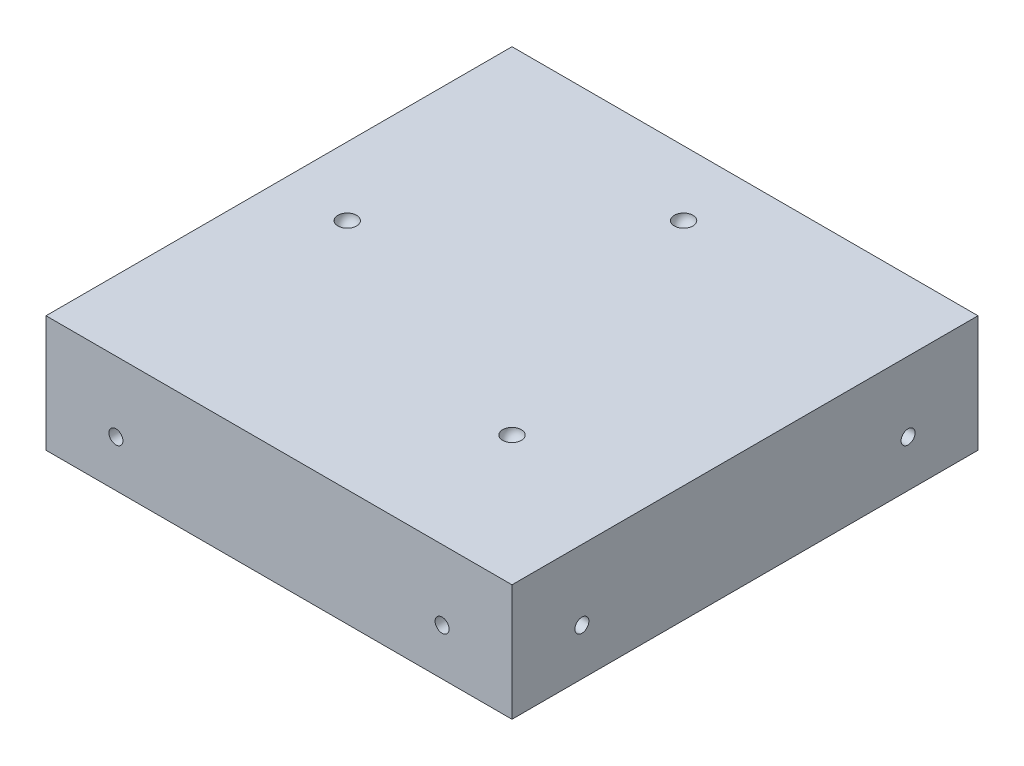
ISO-10303-21;
HEADER;
FILE_DESCRIPTION(('STEP AP214'),'2;1');
FILE_NAME('part.step','',(''),(''),'','','');
FILE_SCHEMA(('AUTOMOTIVE_DESIGN { 1 0 10303 214 1 1 1 1 }'));
ENDSEC;
DATA;
#1=APPLICATION_CONTEXT('core data for automotive mechanical design processes');
#2=APPLICATION_PROTOCOL_DEFINITION('international standard','automotive_design',2000,#1);
#3=PRODUCT_CONTEXT('',#1,'mechanical');
#4=PRODUCT('Part','Part','',(#3));
#5=PRODUCT_RELATED_PRODUCT_CATEGORY('part','',(#4));
#6=PRODUCT_DEFINITION_FORMATION('','',#4);
#7=PRODUCT_DEFINITION_CONTEXT('part definition',#1,'design');
#8=PRODUCT_DEFINITION('design','',#6,#7);
#9=PRODUCT_DEFINITION_SHAPE('','',#8);
#10=(LENGTH_UNIT() NAMED_UNIT(*) SI_UNIT(.MILLI.,.METRE.));
#11=(NAMED_UNIT(*) PLANE_ANGLE_UNIT() SI_UNIT($,.RADIAN.));
#12=(NAMED_UNIT(*) SI_UNIT($,.STERADIAN.) SOLID_ANGLE_UNIT());
#13=UNCERTAINTY_MEASURE_WITH_UNIT(LENGTH_MEASURE(1.E-05),#10,'distance_accuracy_value','');
#14=(GEOMETRIC_REPRESENTATION_CONTEXT(3) GLOBAL_UNCERTAINTY_ASSIGNED_CONTEXT((#13)) GLOBAL_UNIT_ASSIGNED_CONTEXT((#10,
#11,#12)) REPRESENTATION_CONTEXT('',''));
#15=CARTESIAN_POINT('',(0.,0.,0.));
#16=DIRECTION('',(0.,0.,1.));
#17=DIRECTION('',(1.,0.,0.));
#18=AXIS2_PLACEMENT_3D('',#15,#16,#17);
#19=CARTESIAN_POINT('',(50.,25.,-50.));
#20=DIRECTION('',(-1.,0.,0.));
#21=DIRECTION('',(0.,0.,1.));
#22=AXIS2_PLACEMENT_3D('',#19,#20,#21);
#23=PLANE('',#22);
#24=CARTESIAN_POINT('',(50.,10.,-35.));
#25=DIRECTION('',(1.,0.,0.));
#26=DIRECTION('',(0.,0.,-1.));
#27=AXIS2_PLACEMENT_3D('',#24,#25,#26);
#28=CIRCLE('',#27,1.5);
#29=CARTESIAN_POINT('',(50.,10.,-36.5));
#30=VERTEX_POINT('',#29);
#31=EDGE_CURVE('E139',#30,#30,#28,.T.);
#32=ORIENTED_EDGE('',*,*,#31,.F.);
#33=EDGE_LOOP('',(#32));
#34=FACE_BOUND('',#33,.T.);
#35=CARTESIAN_POINT('',(50.,10.,35.));
#36=DIRECTION('',(1.,0.,0.));
#37=DIRECTION('',(0.,0.,-1.));
#38=AXIS2_PLACEMENT_3D('',#35,#36,#37);
#39=CIRCLE('',#38,1.5);
#40=CARTESIAN_POINT('',(50.,10.,33.5));
#41=VERTEX_POINT('',#40);
#42=EDGE_CURVE('E133',#41,#41,#39,.T.);
#43=ORIENTED_EDGE('',*,*,#42,.F.);
#44=EDGE_LOOP('',(#43));
#45=FACE_BOUND('',#44,.T.);
#46=DIRECTION('',(0.,0.,-1.));
#47=VECTOR('',#46,1.);
#48=CARTESIAN_POINT('',(50.,0.,-50.));
#49=LINE('',#48,#47);
#50=CARTESIAN_POINT('',(50.,0.,50.));
#51=VERTEX_POINT('',#50);
#52=CARTESIAN_POINT('',(50.,0.,-50.));
#53=VERTEX_POINT('',#52);
#54=EDGE_CURVE('E100',#51,#53,#49,.T.);
#55=ORIENTED_EDGE('',*,*,#54,.T.);
#56=DIRECTION('',(0.,-1.,0.));
#57=VECTOR('',#56,1.);
#58=CARTESIAN_POINT('',(50.,25.,-50.));
#59=LINE('',#58,#57);
#60=CARTESIAN_POINT('',(50.,25.,-50.));
#61=VERTEX_POINT('',#60);
#62=EDGE_CURVE('E11',#61,#53,#59,.T.);
#63=ORIENTED_EDGE('',*,*,#62,.F.);
#64=DIRECTION('',(0.,0.,-1.));
#65=VECTOR('',#64,1.);
#66=CARTESIAN_POINT('',(50.,25.,-50.));
#67=LINE('',#66,#65);
#68=CARTESIAN_POINT('',(50.,25.,50.));
#69=VERTEX_POINT('',#68);
#70=EDGE_CURVE('E87',#69,#61,#67,.T.);
#71=ORIENTED_EDGE('',*,*,#70,.F.);
#72=DIRECTION('',(0.,-1.,0.));
#73=VECTOR('',#72,1.);
#74=CARTESIAN_POINT('',(50.,25.,50.));
#75=LINE('',#74,#73);
#76=EDGE_CURVE('E96',#69,#51,#75,.T.);
#77=ORIENTED_EDGE('',*,*,#76,.T.);
#78=EDGE_LOOP('',(#55,#63,#71,#77));
#79=FACE_BOUND('',#78,.T.);
#80=ADVANCED_FACE('F34',(#34,#45,#79),#23,.F.);
#81=CARTESIAN_POINT('',(-50.,25.,-50.));
#82=DIRECTION('',(0.,0.,1.));
#83=DIRECTION('',(1.,0.,0.));
#84=AXIS2_PLACEMENT_3D('',#81,#82,#83);
#85=PLANE('',#84);
#86=CARTESIAN_POINT('',(-35.,10.,-50.));
#87=DIRECTION('',(0.,0.,-1.));
#88=DIRECTION('',(-1.,0.,0.));
#89=AXIS2_PLACEMENT_3D('',#86,#87,#88);
#90=CIRCLE('',#89,1.5);
#91=CARTESIAN_POINT('',(-36.5,10.,-50.));
#92=VERTEX_POINT('',#91);
#93=EDGE_CURVE('E151',#92,#92,#90,.T.);
#94=ORIENTED_EDGE('',*,*,#93,.F.);
#95=EDGE_LOOP('',(#94));
#96=FACE_BOUND('',#95,.T.);
#97=CARTESIAN_POINT('',(35.,10.,-50.));
#98=DIRECTION('',(0.,0.,-1.));
#99=DIRECTION('',(-1.,0.,0.));
#100=AXIS2_PLACEMENT_3D('',#97,#98,#99);
#101=CIRCLE('',#100,1.5);
#102=CARTESIAN_POINT('',(33.5,10.,-50.));
#103=VERTEX_POINT('',#102);
#104=EDGE_CURVE('E145',#103,#103,#101,.T.);
#105=ORIENTED_EDGE('',*,*,#104,.F.);
#106=EDGE_LOOP('',(#105));
#107=FACE_BOUND('',#106,.T.);
#108=DIRECTION('',(-1.,0.,0.));
#109=VECTOR('',#108,1.);
#110=CARTESIAN_POINT('',(-50.,0.,-50.));
#111=LINE('',#110,#109);
#112=CARTESIAN_POINT('',(-50.,0.,-50.));
#113=VERTEX_POINT('',#112);
#114=EDGE_CURVE('E91',#53,#113,#111,.T.);
#115=ORIENTED_EDGE('',*,*,#114,.T.);
#116=DIRECTION('',(0.,-1.,0.));
#117=VECTOR('',#116,1.);
#118=CARTESIAN_POINT('',(-50.,25.,-50.));
#119=LINE('',#118,#117);
#120=CARTESIAN_POINT('',(-50.,25.,-50.));
#121=VERTEX_POINT('',#120);
#122=EDGE_CURVE('E43',#121,#113,#119,.T.);
#123=ORIENTED_EDGE('',*,*,#122,.F.);
#124=DIRECTION('',(-1.,0.,0.));
#125=VECTOR('',#124,1.);
#126=CARTESIAN_POINT('',(-50.,25.,-50.));
#127=LINE('',#126,#125);
#128=EDGE_CURVE('E82',#61,#121,#127,.T.);
#129=ORIENTED_EDGE('',*,*,#128,.F.);
#130=ORIENTED_EDGE('',*,*,#62,.T.);
#131=EDGE_LOOP('',(#115,#123,#129,#130));
#132=FACE_BOUND('',#131,.T.);
#133=ADVANCED_FACE('F90',(#96,#107,#132),#85,.F.);
#134=CARTESIAN_POINT('',(-50.,25.,-50.));
#135=DIRECTION('',(1.,0.,0.));
#136=DIRECTION('',(0.,0.,-1.));
#137=AXIS2_PLACEMENT_3D('',#134,#135,#136);
#138=PLANE('',#137);
#139=CARTESIAN_POINT('',(-50.,10.,35.));
#140=DIRECTION('',(-1.,0.,0.));
#141=DIRECTION('',(0.,0.,1.));
#142=AXIS2_PLACEMENT_3D('',#139,#140,#141);
#143=CIRCLE('',#142,1.5);
#144=CARTESIAN_POINT('',(-50.,10.,36.5));
#145=VERTEX_POINT('',#144);
#146=EDGE_CURVE('E163',#145,#145,#143,.T.);
#147=ORIENTED_EDGE('',*,*,#146,.F.);
#148=EDGE_LOOP('',(#147));
#149=FACE_BOUND('',#148,.T.);
#150=CARTESIAN_POINT('',(-50.,10.,-35.));
#151=DIRECTION('',(-1.,0.,0.));
#152=DIRECTION('',(0.,0.,1.));
#153=AXIS2_PLACEMENT_3D('',#150,#151,#152);
#154=CIRCLE('',#153,1.5);
#155=CARTESIAN_POINT('',(-50.,10.,-33.5));
#156=VERTEX_POINT('',#155);
#157=EDGE_CURVE('E157',#156,#156,#154,.T.);
#158=ORIENTED_EDGE('',*,*,#157,.F.);
#159=EDGE_LOOP('',(#158));
#160=FACE_BOUND('',#159,.T.);
#161=DIRECTION('',(0.,0.,1.));
#162=VECTOR('',#161,1.);
#163=CARTESIAN_POINT('',(-50.,0.,-50.));
#164=LINE('',#163,#162);
#165=CARTESIAN_POINT('',(-50.,0.,50.));
#166=VERTEX_POINT('',#165);
#167=EDGE_CURVE('E69',#113,#166,#164,.T.);
#168=ORIENTED_EDGE('',*,*,#167,.T.);
#169=DIRECTION('',(0.,-1.,0.));
#170=VECTOR('',#169,1.);
#171=CARTESIAN_POINT('',(-50.,25.,50.));
#172=LINE('',#171,#170);
#173=CARTESIAN_POINT('',(-50.,25.,50.));
#174=VERTEX_POINT('',#173);
#175=EDGE_CURVE('E92',#174,#166,#172,.T.);
#176=ORIENTED_EDGE('',*,*,#175,.F.);
#177=DIRECTION('',(0.,0.,1.));
#178=VECTOR('',#177,1.);
#179=CARTESIAN_POINT('',(-50.,25.,-50.));
#180=LINE('',#179,#178);
#181=EDGE_CURVE('E85',#121,#174,#180,.T.);
#182=ORIENTED_EDGE('',*,*,#181,.F.);
#183=ORIENTED_EDGE('',*,*,#122,.T.);
#184=EDGE_LOOP('',(#168,#176,#182,#183));
#185=FACE_BOUND('',#184,.T.);
#186=ADVANCED_FACE('F94',(#149,#160,#185),#138,.F.);
#187=CARTESIAN_POINT('',(-50.,25.,50.));
#188=DIRECTION('',(0.,0.,-1.));
#189=DIRECTION('',(-1.,0.,0.));
#190=AXIS2_PLACEMENT_3D('',#187,#188,#189);
#191=PLANE('',#190);
#192=CARTESIAN_POINT('',(35.,10.,50.));
#193=DIRECTION('',(0.,0.,1.));
#194=DIRECTION('',(1.,0.,0.));
#195=AXIS2_PLACEMENT_3D('',#192,#193,#194);
#196=CIRCLE('',#195,1.5);
#197=CARTESIAN_POINT('',(36.5,10.,50.));
#198=VERTEX_POINT('',#197);
#199=EDGE_CURVE('E127',#198,#198,#196,.T.);
#200=ORIENTED_EDGE('',*,*,#199,.F.);
#201=EDGE_LOOP('',(#200));
#202=FACE_BOUND('',#201,.T.);
#203=CARTESIAN_POINT('',(-35.,10.,50.));
#204=DIRECTION('',(0.,0.,1.));
#205=DIRECTION('',(1.,0.,0.));
#206=AXIS2_PLACEMENT_3D('',#203,#204,#205);
#207=CIRCLE('',#206,1.5);
#208=CARTESIAN_POINT('',(-33.5,10.,50.));
#209=VERTEX_POINT('',#208);
#210=EDGE_CURVE('E119',#209,#209,#207,.T.);
#211=ORIENTED_EDGE('',*,*,#210,.F.);
#212=EDGE_LOOP('',(#211));
#213=FACE_BOUND('',#212,.T.);
#214=DIRECTION('',(1.,0.,0.));
#215=VECTOR('',#214,1.);
#216=CARTESIAN_POINT('',(-50.,0.,50.));
#217=LINE('',#216,#215);
#218=EDGE_CURVE('E75',#166,#51,#217,.T.);
#219=ORIENTED_EDGE('',*,*,#218,.T.);
#220=ORIENTED_EDGE('',*,*,#76,.F.);
#221=DIRECTION('',(1.,0.,0.));
#222=VECTOR('',#221,1.);
#223=CARTESIAN_POINT('',(-50.,25.,50.));
#224=LINE('',#223,#222);
#225=EDGE_CURVE('E52',#174,#69,#224,.T.);
#226=ORIENTED_EDGE('',*,*,#225,.F.);
#227=ORIENTED_EDGE('',*,*,#175,.T.);
#228=EDGE_LOOP('',(#219,#220,#226,#227));
#229=FACE_BOUND('',#228,.T.);
#230=ADVANCED_FACE('F180',(#202,#213,#229),#191,.F.);
#231=CARTESIAN_POINT('',(0.,25.,0.));
#232=DIRECTION('',(0.,1.,0.));
#233=DIRECTION('',(0.,0.,1.));
#234=AXIS2_PLACEMENT_3D('',#231,#232,#233);
#235=PLANE('',#234);
#236=CARTESIAN_POINT('',(22.1678315681881,25.,22.1678315681881));
#237=DIRECTION('',(0.,1.,0.));
#238=DIRECTION('',(0.,0.,1.));
#239=AXIS2_PLACEMENT_3D('',#236,#237,#238);
#240=CIRCLE('',#239,2.);
#241=CARTESIAN_POINT('',(22.1678315681881,25.,24.1678315681881));
#242=VERTEX_POINT('',#241);
#243=EDGE_CURVE('E37',#242,#242,#240,.F.);
#244=ORIENTED_EDGE('',*,*,#243,.T.);
#245=EDGE_LOOP('',(#244));
#246=FACE_BOUND('',#245,.T.);
#247=CARTESIAN_POINT('',(0.73373407162599,25.,-36.0890731309555));
#248=DIRECTION('',(0.,1.,0.));
#249=DIRECTION('',(0.,0.,1.));
#250=AXIS2_PLACEMENT_3D('',#247,#248,#249);
#251=CIRCLE('',#250,2.);
#252=CARTESIAN_POINT('',(0.73373407162599,25.,-34.0890731309555));
#253=VERTEX_POINT('',#252);
#254=EDGE_CURVE('E110',#253,#253,#251,.T.);
#255=ORIENTED_EDGE('',*,*,#254,.F.);
#256=EDGE_LOOP('',(#255));
#257=FACE_BOUND('',#256,.T.);
#258=CARTESIAN_POINT('',(-35.3553390593274,25.,0.));
#259=DIRECTION('',(0.,1.,0.));
#260=DIRECTION('',(0.,0.,1.));
#261=AXIS2_PLACEMENT_3D('',#258,#259,#260);
#262=CIRCLE('',#261,2.);
#263=CARTESIAN_POINT('',(-35.3553390593274,25.,2.));
#264=VERTEX_POINT('',#263);
#265=EDGE_CURVE('E103',#264,#264,#262,.F.);
#266=ORIENTED_EDGE('',*,*,#265,.T.);
#267=EDGE_LOOP('',(#266));
#268=FACE_BOUND('',#267,.T.);
#269=ORIENTED_EDGE('',*,*,#70,.T.);
#270=ORIENTED_EDGE('',*,*,#128,.T.);
#271=ORIENTED_EDGE('',*,*,#181,.T.);
#272=ORIENTED_EDGE('',*,*,#225,.T.);
#273=EDGE_LOOP('',(#269,#270,#271,#272));
#274=FACE_BOUND('',#273,.T.);
#275=ADVANCED_FACE('F83',(#246,#257,#268,#274),#235,.T.);
#276=CARTESIAN_POINT('',(0.,0.,0.));
#277=DIRECTION('',(0.,1.,0.));
#278=DIRECTION('',(0.,0.,1.));
#279=AXIS2_PLACEMENT_3D('',#276,#277,#278);
#280=PLANE('',#279);
#281=ORIENTED_EDGE('',*,*,#54,.F.);
#282=ORIENTED_EDGE('',*,*,#218,.F.);
#283=ORIENTED_EDGE('',*,*,#167,.F.);
#284=ORIENTED_EDGE('',*,*,#114,.F.);
#285=EDGE_LOOP('',(#281,#282,#283,#284));
#286=FACE_BOUND('',#285,.T.);
#287=ADVANCED_FACE('F211',(#286),#280,.F.);
#288=CARTESIAN_POINT('',(-35.3553390593274,25.,0.));
#289=DIRECTION('',(-0.707106781186549,0.,-0.707106781186546));
#290=DIRECTION('',(-0.707106781186546,0.,0.707106781186549));
#291=AXIS2_PLACEMENT_3D('',#288,#289,#290);
#292=SPHERICAL_SURFACE('',#291,2.);
#293=CARTESIAN_POINT('',(-35.3553390593274,25.,0.));
#294=DIRECTION('',(0.,1.,0.));
#295=DIRECTION('',(0.,0.,1.));
#296=AXIS2_PLACEMENT_3D('',#293,#294,#295);
#297=SPHERICAL_SURFACE('',#296,2.);
#298=ORIENTED_EDGE('',*,*,#265,.F.);
#299=EDGE_LOOP('',(#298));
#300=FACE_BOUND('',#299,.T.);
#301=ADVANCED_FACE('F213',(#300),#297,.F.);
#302=CARTESIAN_POINT('',(0.73373407162599,25.,-36.0890731309555));
#303=DIRECTION('',(0.707106781186548,0.,0.707106781186547));
#304=DIRECTION('',(0.707106781186547,0.,-0.707106781186548));
#305=AXIS2_PLACEMENT_3D('',#302,#303,#304);
#306=SPHERICAL_SURFACE('',#305,2.);
#307=CARTESIAN_POINT('',(0.73373407162599,25.,-36.0890731309555));
#308=DIRECTION('',(0.,1.,0.));
#309=DIRECTION('',(0.,0.,1.));
#310=AXIS2_PLACEMENT_3D('',#307,#308,#309);
#311=SPHERICAL_SURFACE('',#310,2.);
#312=ORIENTED_EDGE('',*,*,#254,.T.);
#313=EDGE_LOOP('',(#312));
#314=FACE_BOUND('',#313,.T.);
#315=ADVANCED_FACE('F219',(#314),#311,.F.);
#316=CARTESIAN_POINT('',(22.1678315681881,25.,22.1678315681881));
#317=DIRECTION('',(-0.707106781186548,0.,-0.707106781186548));
#318=DIRECTION('',(0.707106781186548,0.,-0.707106781186548));
#319=AXIS2_PLACEMENT_3D('',#316,#317,#318);
#320=SPHERICAL_SURFACE('',#319,2.);
#321=CARTESIAN_POINT('',(22.1678315681881,25.,22.1678315681881));
#322=DIRECTION('',(0.,1.,0.));
#323=DIRECTION('',(0.,0.,1.));
#324=AXIS2_PLACEMENT_3D('',#321,#322,#323);
#325=SPHERICAL_SURFACE('',#324,2.);
#326=ORIENTED_EDGE('',*,*,#243,.F.);
#327=EDGE_LOOP('',(#326));
#328=FACE_BOUND('',#327,.T.);
#329=ADVANCED_FACE('F235',(#328),#325,.F.);
#330=CARTESIAN_POINT('',(-35.,10.,45.));
#331=DIRECTION('',(0.,0.,1.));
#332=DIRECTION('',(1.,0.,0.));
#333=AXIS2_PLACEMENT_3D('',#330,#331,#332);
#334=CYLINDRICAL_SURFACE('',#333,1.5);
#335=CARTESIAN_POINT('',(-35.,10.,45.));
#336=DIRECTION('',(0.,0.,1.));
#337=DIRECTION('',(1.,0.,0.));
#338=AXIS2_PLACEMENT_3D('',#335,#336,#337);
#339=CIRCLE('',#338,1.5);
#340=CARTESIAN_POINT('',(-33.5,10.,45.));
#341=VERTEX_POINT('',#340);
#342=EDGE_CURVE('E115',#341,#341,#339,.T.);
#343=ORIENTED_EDGE('',*,*,#342,.F.);
#344=EDGE_LOOP('',(#343));
#345=FACE_BOUND('',#344,.T.);
#346=ORIENTED_EDGE('',*,*,#210,.T.);
#347=EDGE_LOOP('',(#346));
#348=FACE_BOUND('',#347,.T.);
#349=ADVANCED_FACE('F232',(#345,#348),#334,.F.);
#350=CARTESIAN_POINT('',(-35.,10.,45.));
#351=DIRECTION('',(0.,0.,1.));
#352=DIRECTION('',(1.,0.,0.));
#353=AXIS2_PLACEMENT_3D('',#350,#351,#352);
#354=PLANE('',#353);
#355=ORIENTED_EDGE('',*,*,#342,.T.);
#356=EDGE_LOOP('',(#355));
#357=FACE_BOUND('',#356,.T.);
#358=ADVANCED_FACE('F234',(#357),#354,.T.);
#359=CARTESIAN_POINT('',(35.,10.,45.));
#360=DIRECTION('',(0.,0.,1.));
#361=DIRECTION('',(1.,0.,0.));
#362=AXIS2_PLACEMENT_3D('',#359,#360,#361);
#363=CYLINDRICAL_SURFACE('',#362,1.5);
#364=CARTESIAN_POINT('',(35.,10.,45.));
#365=DIRECTION('',(0.,0.,1.));
#366=DIRECTION('',(1.,0.,0.));
#367=AXIS2_PLACEMENT_3D('',#364,#365,#366);
#368=CIRCLE('',#367,1.5);
#369=CARTESIAN_POINT('',(36.5,10.,45.));
#370=VERTEX_POINT('',#369);
#371=EDGE_CURVE('E124',#370,#370,#368,.T.);
#372=ORIENTED_EDGE('',*,*,#371,.F.);
#373=EDGE_LOOP('',(#372));
#374=FACE_BOUND('',#373,.T.);
#375=ORIENTED_EDGE('',*,*,#199,.T.);
#376=EDGE_LOOP('',(#375));
#377=FACE_BOUND('',#376,.T.);
#378=ADVANCED_FACE('F242',(#374,#377),#363,.F.);
#379=CARTESIAN_POINT('',(35.,10.,45.));
#380=DIRECTION('',(0.,0.,1.));
#381=DIRECTION('',(1.,0.,0.));
#382=AXIS2_PLACEMENT_3D('',#379,#380,#381);
#383=PLANE('',#382);
#384=ORIENTED_EDGE('',*,*,#371,.T.);
#385=EDGE_LOOP('',(#384));
#386=FACE_BOUND('',#385,.T.);
#387=ADVANCED_FACE('F284',(#386),#383,.T.);
#388=CARTESIAN_POINT('',(45.,10.,35.));
#389=DIRECTION('',(1.,0.,0.));
#390=DIRECTION('',(0.,0.,-1.));
#391=AXIS2_PLACEMENT_3D('',#388,#389,#390);
#392=CYLINDRICAL_SURFACE('',#391,1.5);
#393=CARTESIAN_POINT('',(45.,10.,35.));
#394=DIRECTION('',(1.,0.,0.));
#395=DIRECTION('',(0.,0.,-1.));
#396=AXIS2_PLACEMENT_3D('',#393,#394,#395);
#397=CIRCLE('',#396,1.5);
#398=CARTESIAN_POINT('',(45.,10.,33.5));
#399=VERTEX_POINT('',#398);
#400=EDGE_CURVE('E130',#399,#399,#397,.T.);
#401=ORIENTED_EDGE('',*,*,#400,.F.);
#402=EDGE_LOOP('',(#401));
#403=FACE_BOUND('',#402,.T.);
#404=ORIENTED_EDGE('',*,*,#42,.T.);
#405=EDGE_LOOP('',(#404));
#406=FACE_BOUND('',#405,.T.);
#407=ADVANCED_FACE('F292',(#403,#406),#392,.F.);
#408=CARTESIAN_POINT('',(45.,10.,35.));
#409=DIRECTION('',(1.,0.,0.));
#410=DIRECTION('',(0.,0.,-1.));
#411=AXIS2_PLACEMENT_3D('',#408,#409,#410);
#412=PLANE('',#411);
#413=ORIENTED_EDGE('',*,*,#400,.T.);
#414=EDGE_LOOP('',(#413));
#415=FACE_BOUND('',#414,.T.);
#416=ADVANCED_FACE('F308',(#415),#412,.T.);
#417=CARTESIAN_POINT('',(45.,10.,-35.));
#418=DIRECTION('',(1.,0.,0.));
#419=DIRECTION('',(0.,0.,-1.));
#420=AXIS2_PLACEMENT_3D('',#417,#418,#419);
#421=CYLINDRICAL_SURFACE('',#420,1.5);
#422=CARTESIAN_POINT('',(45.,10.,-35.));
#423=DIRECTION('',(1.,0.,0.));
#424=DIRECTION('',(0.,0.,-1.));
#425=AXIS2_PLACEMENT_3D('',#422,#423,#424);
#426=CIRCLE('',#425,1.5);
#427=CARTESIAN_POINT('',(45.,10.,-36.5));
#428=VERTEX_POINT('',#427);
#429=EDGE_CURVE('E136',#428,#428,#426,.T.);
#430=ORIENTED_EDGE('',*,*,#429,.F.);
#431=EDGE_LOOP('',(#430));
#432=FACE_BOUND('',#431,.T.);
#433=ORIENTED_EDGE('',*,*,#31,.T.);
#434=EDGE_LOOP('',(#433));
#435=FACE_BOUND('',#434,.T.);
#436=ADVANCED_FACE('F318',(#432,#435),#421,.F.);
#437=CARTESIAN_POINT('',(45.,10.,-35.));
#438=DIRECTION('',(1.,0.,0.));
#439=DIRECTION('',(0.,0.,-1.));
#440=AXIS2_PLACEMENT_3D('',#437,#438,#439);
#441=PLANE('',#440);
#442=ORIENTED_EDGE('',*,*,#429,.T.);
#443=EDGE_LOOP('',(#442));
#444=FACE_BOUND('',#443,.T.);
#445=ADVANCED_FACE('F328',(#444),#441,.T.);
#446=CARTESIAN_POINT('',(35.,10.,-45.));
#447=DIRECTION('',(0.,0.,-1.));
#448=DIRECTION('',(-1.,0.,0.));
#449=AXIS2_PLACEMENT_3D('',#446,#447,#448);
#450=CYLINDRICAL_SURFACE('',#449,1.5);
#451=CARTESIAN_POINT('',(35.,10.,-45.));
#452=DIRECTION('',(0.,0.,-1.));
#453=DIRECTION('',(-1.,0.,0.));
#454=AXIS2_PLACEMENT_3D('',#451,#452,#453);
#455=CIRCLE('',#454,1.5);
#456=CARTESIAN_POINT('',(33.5,10.,-45.));
#457=VERTEX_POINT('',#456);
#458=EDGE_CURVE('E142',#457,#457,#455,.T.);
#459=ORIENTED_EDGE('',*,*,#458,.F.);
#460=EDGE_LOOP('',(#459));
#461=FACE_BOUND('',#460,.T.);
#462=ORIENTED_EDGE('',*,*,#104,.T.);
#463=EDGE_LOOP('',(#462));
#464=FACE_BOUND('',#463,.T.);
#465=ADVANCED_FACE('F338',(#461,#464),#450,.F.);
#466=CARTESIAN_POINT('',(35.,10.,-45.));
#467=DIRECTION('',(0.,0.,-1.));
#468=DIRECTION('',(-1.,0.,0.));
#469=AXIS2_PLACEMENT_3D('',#466,#467,#468);
#470=PLANE('',#469);
#471=ORIENTED_EDGE('',*,*,#458,.T.);
#472=EDGE_LOOP('',(#471));
#473=FACE_BOUND('',#472,.T.);
#474=ADVANCED_FACE('F353',(#473),#470,.T.);
#475=CARTESIAN_POINT('',(-35.,10.,-45.));
#476=DIRECTION('',(0.,0.,-1.));
#477=DIRECTION('',(-1.,0.,0.));
#478=AXIS2_PLACEMENT_3D('',#475,#476,#477);
#479=CYLINDRICAL_SURFACE('',#478,1.5);
#480=CARTESIAN_POINT('',(-35.,10.,-45.));
#481=DIRECTION('',(0.,0.,-1.));
#482=DIRECTION('',(-1.,0.,0.));
#483=AXIS2_PLACEMENT_3D('',#480,#481,#482);
#484=CIRCLE('',#483,1.5);
#485=CARTESIAN_POINT('',(-36.5,10.,-45.));
#486=VERTEX_POINT('',#485);
#487=EDGE_CURVE('E148',#486,#486,#484,.T.);
#488=ORIENTED_EDGE('',*,*,#487,.F.);
#489=EDGE_LOOP('',(#488));
#490=FACE_BOUND('',#489,.T.);
#491=ORIENTED_EDGE('',*,*,#93,.T.);
#492=EDGE_LOOP('',(#491));
#493=FACE_BOUND('',#492,.T.);
#494=ADVANCED_FACE('F195',(#490,#493),#479,.F.);
#495=CARTESIAN_POINT('',(-35.,10.,-45.));
#496=DIRECTION('',(0.,0.,-1.));
#497=DIRECTION('',(-1.,0.,0.));
#498=AXIS2_PLACEMENT_3D('',#495,#496,#497);
#499=PLANE('',#498);
#500=ORIENTED_EDGE('',*,*,#487,.T.);
#501=EDGE_LOOP('',(#500));
#502=FACE_BOUND('',#501,.T.);
#503=ADVANCED_FACE('F186',(#502),#499,.T.);
#504=CARTESIAN_POINT('',(-45.,10.,-35.));
#505=DIRECTION('',(-1.,0.,0.));
#506=DIRECTION('',(0.,0.,1.));
#507=AXIS2_PLACEMENT_3D('',#504,#505,#506);
#508=CYLINDRICAL_SURFACE('',#507,1.5);
#509=CARTESIAN_POINT('',(-45.,10.,-35.));
#510=DIRECTION('',(-1.,0.,0.));
#511=DIRECTION('',(0.,0.,1.));
#512=AXIS2_PLACEMENT_3D('',#509,#510,#511);
#513=CIRCLE('',#512,1.5);
#514=CARTESIAN_POINT('',(-45.,10.,-33.5));
#515=VERTEX_POINT('',#514);
#516=EDGE_CURVE('E154',#515,#515,#513,.T.);
#517=ORIENTED_EDGE('',*,*,#516,.F.);
#518=EDGE_LOOP('',(#517));
#519=FACE_BOUND('',#518,.T.);
#520=ORIENTED_EDGE('',*,*,#157,.T.);
#521=EDGE_LOOP('',(#520));
#522=FACE_BOUND('',#521,.T.);
#523=ADVANCED_FACE('F184',(#519,#522),#508,.F.);
#524=CARTESIAN_POINT('',(-45.,10.,-35.));
#525=DIRECTION('',(-1.,0.,0.));
#526=DIRECTION('',(0.,0.,1.));
#527=AXIS2_PLACEMENT_3D('',#524,#525,#526);
#528=PLANE('',#527);
#529=ORIENTED_EDGE('',*,*,#516,.T.);
#530=EDGE_LOOP('',(#529));
#531=FACE_BOUND('',#530,.T.);
#532=ADVANCED_FACE('F174',(#531),#528,.T.);
#533=CARTESIAN_POINT('',(-45.,10.,35.));
#534=DIRECTION('',(-1.,0.,0.));
#535=DIRECTION('',(0.,0.,1.));
#536=AXIS2_PLACEMENT_3D('',#533,#534,#535);
#537=CYLINDRICAL_SURFACE('',#536,1.5);
#538=CARTESIAN_POINT('',(-45.,10.,35.));
#539=DIRECTION('',(-1.,0.,0.));
#540=DIRECTION('',(0.,0.,1.));
#541=AXIS2_PLACEMENT_3D('',#538,#539,#540);
#542=CIRCLE('',#541,1.5);
#543=CARTESIAN_POINT('',(-45.,10.,36.5));
#544=VERTEX_POINT('',#543);
#545=EDGE_CURVE('E160',#544,#544,#542,.T.);
#546=ORIENTED_EDGE('',*,*,#545,.F.);
#547=EDGE_LOOP('',(#546));
#548=FACE_BOUND('',#547,.T.);
#549=ORIENTED_EDGE('',*,*,#146,.T.);
#550=EDGE_LOOP('',(#549));
#551=FACE_BOUND('',#550,.T.);
#552=ADVANCED_FACE('F171',(#548,#551),#537,.F.);
#553=CARTESIAN_POINT('',(-45.,10.,35.));
#554=DIRECTION('',(-1.,0.,0.));
#555=DIRECTION('',(0.,0.,1.));
#556=AXIS2_PLACEMENT_3D('',#553,#554,#555);
#557=PLANE('',#556);
#558=ORIENTED_EDGE('',*,*,#545,.T.);
#559=EDGE_LOOP('',(#558));
#560=FACE_BOUND('',#559,.T.);
#561=ADVANCED_FACE('F169',(#560),#557,.T.);
#562=CLOSED_SHELL('',(#80,#133,#186,#230,#275,#287,#301,#315,#329,#349,#358,#378,#387,#407,#416,
#436,#445,#465,#474,#494,#503,#523,#532,#552,#561));
#563=MANIFOLD_SOLID_BREP('B2',#562);
#564=ADVANCED_BREP_SHAPE_REPRESENTATION('',(#18,#563),#14);
#565=SHAPE_DEFINITION_REPRESENTATION(#9,#564);
ENDSEC;
END-ISO-10303-21;
